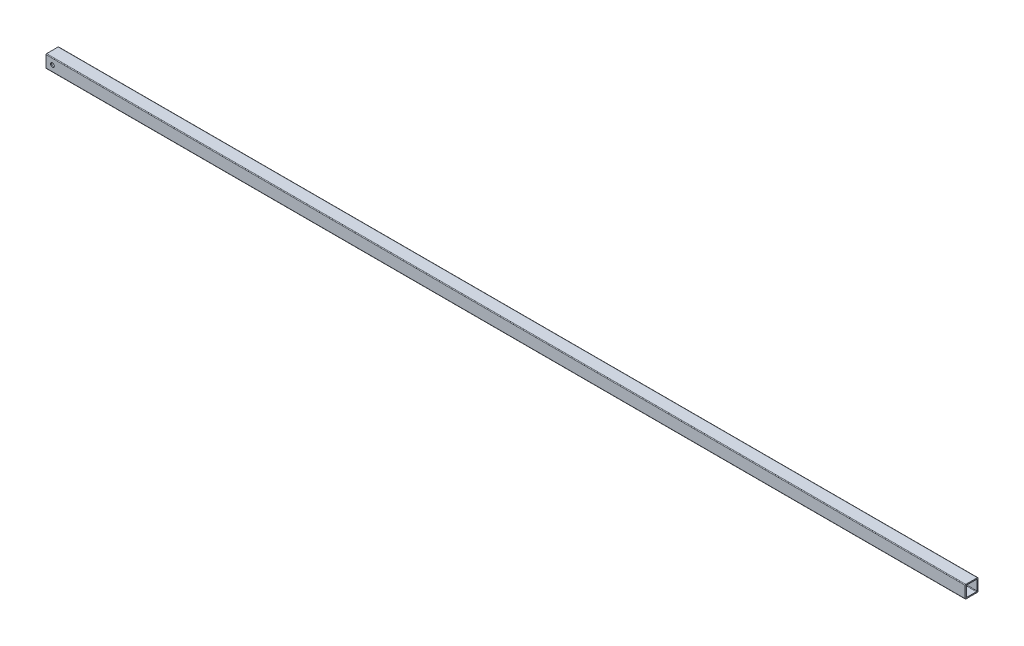
ISO-10303-21;
HEADER;
FILE_DESCRIPTION(('STEP AP214'),'2;1');
FILE_NAME('part.step','',(''),(''),'','','');
FILE_SCHEMA(('AUTOMOTIVE_DESIGN { 1 0 10303 214 1 1 1 1 }'));
ENDSEC;
DATA;
#1=APPLICATION_CONTEXT('core data for automotive mechanical design processes');
#2=APPLICATION_PROTOCOL_DEFINITION('international standard','automotive_design',2000,#1);
#3=PRODUCT_CONTEXT('',#1,'mechanical');
#4=PRODUCT('Part','Part','',(#3));
#5=PRODUCT_RELATED_PRODUCT_CATEGORY('part','',(#4));
#6=PRODUCT_DEFINITION_FORMATION('','',#4);
#7=PRODUCT_DEFINITION_CONTEXT('part definition',#1,'design');
#8=PRODUCT_DEFINITION('design','',#6,#7);
#9=PRODUCT_DEFINITION_SHAPE('','',#8);
#10=(LENGTH_UNIT() NAMED_UNIT(*) SI_UNIT(.MILLI.,.METRE.));
#11=(NAMED_UNIT(*) PLANE_ANGLE_UNIT() SI_UNIT($,.RADIAN.));
#12=(NAMED_UNIT(*) SI_UNIT($,.STERADIAN.) SOLID_ANGLE_UNIT());
#13=UNCERTAINTY_MEASURE_WITH_UNIT(LENGTH_MEASURE(1.E-05),#10,'distance_accuracy_value','');
#14=(GEOMETRIC_REPRESENTATION_CONTEXT(3) GLOBAL_UNCERTAINTY_ASSIGNED_CONTEXT((#13)) GLOBAL_UNIT_ASSIGNED_CONTEXT((#10,
#11,#12)) REPRESENTATION_CONTEXT('',''));
#15=CARTESIAN_POINT('',(0.,0.,0.));
#16=DIRECTION('',(0.,0.,1.));
#17=DIRECTION('',(1.,0.,0.));
#18=AXIS2_PLACEMENT_3D('',#15,#16,#17);
#19=CARTESIAN_POINT('',(914.4,-11.43,-11.43));
#20=DIRECTION('',(1.,0.,0.));
#21=DIRECTION('',(0.,0.,-1.));
#22=AXIS2_PLACEMENT_3D('',#19,#20,#21);
#23=PLANE('',#22);
#24=CARTESIAN_POINT('',(914.4,-11.43,-11.43));
#25=DIRECTION('',(1.,0.,0.));
#26=DIRECTION('',(0.,0.,-1.));
#27=AXIS2_PLACEMENT_3D('',#24,#25,#26);
#28=CIRCLE('',#27,1.27);
#29=CARTESIAN_POINT('',(914.4,-12.7,-11.43));
#30=VERTEX_POINT('',#29);
#31=CARTESIAN_POINT('',(914.4,-11.43,-12.7));
#32=VERTEX_POINT('',#31);
#33=EDGE_CURVE('E167',#30,#32,#28,.T.);
#34=ORIENTED_EDGE('',*,*,#33,.T.);
#35=DIRECTION('',(0.,1.,0.));
#36=VECTOR('',#35,1.);
#37=CARTESIAN_POINT('',(914.4,-11.43,-12.7));
#38=LINE('',#37,#36);
#39=CARTESIAN_POINT('',(914.4,11.43,-12.7));
#40=VERTEX_POINT('',#39);
#41=EDGE_CURVE('E254',#32,#40,#38,.T.);
#42=ORIENTED_EDGE('',*,*,#41,.T.);
#43=CARTESIAN_POINT('',(914.4,11.43,-11.43));
#44=DIRECTION('',(1.,0.,0.));
#45=DIRECTION('',(0.,0.,-1.));
#46=AXIS2_PLACEMENT_3D('',#43,#44,#45);
#47=CIRCLE('',#46,1.27);
#48=CARTESIAN_POINT('',(914.4,12.7,-11.43));
#49=VERTEX_POINT('',#48);
#50=EDGE_CURVE('E256',#40,#49,#47,.T.);
#51=ORIENTED_EDGE('',*,*,#50,.T.);
#52=DIRECTION('',(0.,0.,1.));
#53=VECTOR('',#52,1.);
#54=CARTESIAN_POINT('',(914.4,12.7,-11.43));
#55=LINE('',#54,#53);
#56=CARTESIAN_POINT('',(914.4,12.7,11.43));
#57=VERTEX_POINT('',#56);
#58=EDGE_CURVE('E258',#49,#57,#55,.T.);
#59=ORIENTED_EDGE('',*,*,#58,.T.);
#60=CARTESIAN_POINT('',(914.4,11.43,11.43));
#61=DIRECTION('',(1.,0.,0.));
#62=DIRECTION('',(0.,0.,-1.));
#63=AXIS2_PLACEMENT_3D('',#60,#61,#62);
#64=CIRCLE('',#63,1.27);
#65=CARTESIAN_POINT('',(914.4,11.43,12.7));
#66=VERTEX_POINT('',#65);
#67=EDGE_CURVE('E260',#57,#66,#64,.T.);
#68=ORIENTED_EDGE('',*,*,#67,.T.);
#69=DIRECTION('',(0.,-1.,0.));
#70=VECTOR('',#69,1.);
#71=CARTESIAN_POINT('',(914.4,-11.43,12.7));
#72=LINE('',#71,#70);
#73=CARTESIAN_POINT('',(914.4,-11.43,12.7));
#74=VERTEX_POINT('',#73);
#75=EDGE_CURVE('E262',#66,#74,#72,.T.);
#76=ORIENTED_EDGE('',*,*,#75,.T.);
#77=CARTESIAN_POINT('',(914.4,-11.43,11.43));
#78=DIRECTION('',(1.,0.,0.));
#79=DIRECTION('',(0.,0.,-1.));
#80=AXIS2_PLACEMENT_3D('',#77,#78,#79);
#81=CIRCLE('',#80,1.27);
#82=CARTESIAN_POINT('',(914.4,-12.7,11.43));
#83=VERTEX_POINT('',#82);
#84=EDGE_CURVE('E264',#74,#83,#81,.T.);
#85=ORIENTED_EDGE('',*,*,#84,.T.);
#86=DIRECTION('',(0.,0.,-1.));
#87=VECTOR('',#86,1.);
#88=CARTESIAN_POINT('',(914.4,-12.7,-11.43));
#89=LINE('',#88,#87);
#90=EDGE_CURVE('E66',#83,#30,#89,.T.);
#91=ORIENTED_EDGE('',*,*,#90,.T.);
#92=EDGE_LOOP('',(#34,#42,#51,#59,#68,#76,#85,#91));
#93=FACE_BOUND('',#92,.T.);
#94=DIRECTION('',(0.,0.,1.));
#95=VECTOR('',#94,1.);
#96=CARTESIAN_POINT('',(914.4,10.5918,-9.53261999999999));
#97=LINE('',#96,#95);
#98=CARTESIAN_POINT('',(914.4,10.5918,-9.53261999999999));
#99=VERTEX_POINT('',#98);
#100=CARTESIAN_POINT('',(914.4,10.5918,9.53261999999999));
#101=VERTEX_POINT('',#100);
#102=EDGE_CURVE('E227',#99,#101,#97,.T.);
#103=ORIENTED_EDGE('',*,*,#102,.F.);
#104=CARTESIAN_POINT('',(914.4,9.53261999999999,-9.53262));
#105=DIRECTION('',(1.,0.,0.));
#106=DIRECTION('',(0.,0.,-1.));
#107=AXIS2_PLACEMENT_3D('',#104,#105,#106);
#108=CIRCLE('',#107,1.05918);
#109=CARTESIAN_POINT('',(914.4,9.53261999999999,-10.5918));
#110=VERTEX_POINT('',#109);
#111=EDGE_CURVE('E164',#110,#99,#108,.T.);
#112=ORIENTED_EDGE('',*,*,#111,.F.);
#113=DIRECTION('',(0.,1.,0.));
#114=VECTOR('',#113,1.);
#115=CARTESIAN_POINT('',(914.4,9.53261999999999,-10.5918));
#116=LINE('',#115,#114);
#117=CARTESIAN_POINT('',(914.4,-9.53261999999999,-10.5918));
#118=VERTEX_POINT('',#117);
#119=EDGE_CURVE('E239',#118,#110,#116,.T.);
#120=ORIENTED_EDGE('',*,*,#119,.F.);
#121=CARTESIAN_POINT('',(914.4,-9.53261999999999,-9.53261999999999));
#122=DIRECTION('',(1.,0.,0.));
#123=DIRECTION('',(0.,0.,-1.));
#124=AXIS2_PLACEMENT_3D('',#121,#122,#123);
#125=CIRCLE('',#124,1.05918000000001);
#126=CARTESIAN_POINT('',(914.4,-10.5918,-9.53261999999999));
#127=VERTEX_POINT('',#126);
#128=EDGE_CURVE('E237',#127,#118,#125,.T.);
#129=ORIENTED_EDGE('',*,*,#128,.F.);
#130=DIRECTION('',(0.,0.,-1.));
#131=VECTOR('',#130,1.);
#132=CARTESIAN_POINT('',(914.4,-10.5918,-9.53261999999999));
#133=LINE('',#132,#131);
#134=CARTESIAN_POINT('',(914.4,-10.5918,9.53261999999999));
#135=VERTEX_POINT('',#134);
#136=EDGE_CURVE('E235',#135,#127,#133,.T.);
#137=ORIENTED_EDGE('',*,*,#136,.F.);
#138=CARTESIAN_POINT('',(914.4,-9.53261999999999,9.53261999999999));
#139=DIRECTION('',(1.,0.,0.));
#140=DIRECTION('',(0.,0.,-1.));
#141=AXIS2_PLACEMENT_3D('',#138,#139,#140);
#142=CIRCLE('',#141,1.05918);
#143=CARTESIAN_POINT('',(914.4,-9.53261999999999,10.5918));
#144=VERTEX_POINT('',#143);
#145=EDGE_CURVE('E233',#144,#135,#142,.T.);
#146=ORIENTED_EDGE('',*,*,#145,.F.);
#147=DIRECTION('',(0.,-1.,0.));
#148=VECTOR('',#147,1.);
#149=CARTESIAN_POINT('',(914.4,9.53261999999999,10.5918));
#150=LINE('',#149,#148);
#151=CARTESIAN_POINT('',(914.4,9.53261999999999,10.5918));
#152=VERTEX_POINT('',#151);
#153=EDGE_CURVE('E231',#152,#144,#150,.T.);
#154=ORIENTED_EDGE('',*,*,#153,.F.);
#155=CARTESIAN_POINT('',(914.4,9.53261999999999,9.53261999999999));
#156=DIRECTION('',(1.,0.,0.));
#157=DIRECTION('',(0.,0.,-1.));
#158=AXIS2_PLACEMENT_3D('',#155,#156,#157);
#159=CIRCLE('',#158,1.05918000000001);
#160=EDGE_CURVE('E229',#101,#152,#159,.T.);
#161=ORIENTED_EDGE('',*,*,#160,.F.);
#162=EDGE_LOOP('',(#103,#112,#120,#129,#137,#146,#154,#161));
#163=FACE_BOUND('',#162,.T.);
#164=ADVANCED_FACE('F42',(#93,#163),#23,.T.);
#165=CARTESIAN_POINT('',(914.4,-11.43,-11.43));
#166=DIRECTION('',(-1.,0.,0.));
#167=DIRECTION('',(0.,0.,1.));
#168=AXIS2_PLACEMENT_3D('',#165,#166,#167);
#169=CYLINDRICAL_SURFACE('',#168,1.27);
#170=DIRECTION('',(-1.,0.,0.));
#171=VECTOR('',#170,1.);
#172=CARTESIAN_POINT('',(914.4,-12.7,-11.43));
#173=LINE('',#172,#171);
#174=CARTESIAN_POINT('',(-914.4,-12.7,-11.43));
#175=VERTEX_POINT('',#174);
#176=EDGE_CURVE('E267',#30,#175,#173,.T.);
#177=ORIENTED_EDGE('',*,*,#176,.T.);
#178=CARTESIAN_POINT('',(-914.4,-11.43,-11.43));
#179=DIRECTION('',(1.,0.,0.));
#180=DIRECTION('',(0.,0.,-1.));
#181=AXIS2_PLACEMENT_3D('',#178,#179,#180);
#182=CIRCLE('',#181,1.27);
#183=CARTESIAN_POINT('',(-914.4,-11.43,-12.7));
#184=VERTEX_POINT('',#183);
#185=EDGE_CURVE('E202',#175,#184,#182,.T.);
#186=ORIENTED_EDGE('',*,*,#185,.T.);
#187=DIRECTION('',(-1.,0.,0.));
#188=VECTOR('',#187,1.);
#189=CARTESIAN_POINT('',(914.4,-11.43,-12.7));
#190=LINE('',#189,#188);
#191=EDGE_CURVE('E11',#32,#184,#190,.T.);
#192=ORIENTED_EDGE('',*,*,#191,.F.);
#193=ORIENTED_EDGE('',*,*,#33,.F.);
#194=EDGE_LOOP('',(#177,#186,#192,#193));
#195=FACE_BOUND('',#194,.T.);
#196=ADVANCED_FACE('F44',(#195),#169,.T.);
#197=CARTESIAN_POINT('',(914.4,-11.43,-12.7));
#198=DIRECTION('',(0.,0.,1.));
#199=DIRECTION('',(1.,0.,0.));
#200=AXIS2_PLACEMENT_3D('',#197,#198,#199);
#201=PLANE('',#200);
#202=CARTESIAN_POINT('',(-901.7,0.,-12.7));
#203=DIRECTION('',(0.,0.,1.));
#204=DIRECTION('',(1.,0.,0.));
#205=AXIS2_PLACEMENT_3D('',#202,#203,#204);
#206=CIRCLE('',#205,3.80999999999999);
#207=CARTESIAN_POINT('',(-897.89,0.,-12.7));
#208=VERTEX_POINT('',#207);
#209=EDGE_CURVE('E388',#208,#208,#206,.T.);
#210=ORIENTED_EDGE('',*,*,#209,.T.);
#211=EDGE_LOOP('',(#210));
#212=FACE_BOUND('',#211,.T.);
#213=ORIENTED_EDGE('',*,*,#191,.T.);
#214=DIRECTION('',(0.,1.,0.));
#215=VECTOR('',#214,1.);
#216=CARTESIAN_POINT('',(-914.4,-11.43,-12.7));
#217=LINE('',#216,#215);
#218=CARTESIAN_POINT('',(-914.4,11.43,-12.7));
#219=VERTEX_POINT('',#218);
#220=EDGE_CURVE('E205',#184,#219,#217,.T.);
#221=ORIENTED_EDGE('',*,*,#220,.T.);
#222=DIRECTION('',(-1.,0.,0.));
#223=VECTOR('',#222,1.);
#224=CARTESIAN_POINT('',(914.4,11.43,-12.7));
#225=LINE('',#224,#223);
#226=EDGE_CURVE('E51',#40,#219,#225,.T.);
#227=ORIENTED_EDGE('',*,*,#226,.F.);
#228=ORIENTED_EDGE('',*,*,#41,.F.);
#229=EDGE_LOOP('',(#213,#221,#227,#228));
#230=FACE_BOUND('',#229,.T.);
#231=ADVANCED_FACE('F290',(#212,#230),#201,.F.);
#232=CARTESIAN_POINT('',(914.4,11.43,-11.43));
#233=DIRECTION('',(-1.,0.,0.));
#234=DIRECTION('',(0.,0.,1.));
#235=AXIS2_PLACEMENT_3D('',#232,#233,#234);
#236=CYLINDRICAL_SURFACE('',#235,1.27);
#237=ORIENTED_EDGE('',*,*,#226,.T.);
#238=CARTESIAN_POINT('',(-914.4,11.43,-11.43));
#239=DIRECTION('',(1.,0.,0.));
#240=DIRECTION('',(0.,0.,-1.));
#241=AXIS2_PLACEMENT_3D('',#238,#239,#240);
#242=CIRCLE('',#241,1.27);
#243=CARTESIAN_POINT('',(-914.4,12.7,-11.43));
#244=VERTEX_POINT('',#243);
#245=EDGE_CURVE('E208',#219,#244,#242,.T.);
#246=ORIENTED_EDGE('',*,*,#245,.T.);
#247=DIRECTION('',(-1.,0.,0.));
#248=VECTOR('',#247,1.);
#249=CARTESIAN_POINT('',(914.4,12.7,-11.43));
#250=LINE('',#249,#248);
#251=EDGE_CURVE('E277',#49,#244,#250,.T.);
#252=ORIENTED_EDGE('',*,*,#251,.F.);
#253=ORIENTED_EDGE('',*,*,#50,.F.);
#254=EDGE_LOOP('',(#237,#246,#252,#253));
#255=FACE_BOUND('',#254,.T.);
#256=ADVANCED_FACE('F283',(#255),#236,.T.);
#257=CARTESIAN_POINT('',(914.4,12.7,-11.43));
#258=DIRECTION('',(0.,-1.,0.));
#259=DIRECTION('',(0.,0.,-1.));
#260=AXIS2_PLACEMENT_3D('',#257,#258,#259);
#261=PLANE('',#260);
#262=ORIENTED_EDGE('',*,*,#251,.T.);
#263=DIRECTION('',(0.,0.,1.));
#264=VECTOR('',#263,1.);
#265=CARTESIAN_POINT('',(-914.4,12.7,-11.43));
#266=LINE('',#265,#264);
#267=CARTESIAN_POINT('',(-914.4,12.7,11.43));
#268=VERTEX_POINT('',#267);
#269=EDGE_CURVE('E211',#244,#268,#266,.T.);
#270=ORIENTED_EDGE('',*,*,#269,.T.);
#271=DIRECTION('',(-1.,0.,0.));
#272=VECTOR('',#271,1.);
#273=CARTESIAN_POINT('',(914.4,12.7,11.43));
#274=LINE('',#273,#272);
#275=EDGE_CURVE('E275',#57,#268,#274,.T.);
#276=ORIENTED_EDGE('',*,*,#275,.F.);
#277=ORIENTED_EDGE('',*,*,#58,.F.);
#278=EDGE_LOOP('',(#262,#270,#276,#277));
#279=FACE_BOUND('',#278,.T.);
#280=ADVANCED_FACE('F313',(#279),#261,.F.);
#281=CARTESIAN_POINT('',(914.4,11.43,11.43));
#282=DIRECTION('',(-1.,0.,0.));
#283=DIRECTION('',(0.,0.,1.));
#284=AXIS2_PLACEMENT_3D('',#281,#282,#283);
#285=CYLINDRICAL_SURFACE('',#284,1.27);
#286=ORIENTED_EDGE('',*,*,#275,.T.);
#287=CARTESIAN_POINT('',(-914.4,11.43,11.43));
#288=DIRECTION('',(1.,0.,0.));
#289=DIRECTION('',(0.,0.,-1.));
#290=AXIS2_PLACEMENT_3D('',#287,#288,#289);
#291=CIRCLE('',#290,1.27);
#292=CARTESIAN_POINT('',(-914.4,11.43,12.7));
#293=VERTEX_POINT('',#292);
#294=EDGE_CURVE('E214',#268,#293,#291,.T.);
#295=ORIENTED_EDGE('',*,*,#294,.T.);
#296=DIRECTION('',(-1.,0.,0.));
#297=VECTOR('',#296,1.);
#298=CARTESIAN_POINT('',(914.4,11.43,12.7));
#299=LINE('',#298,#297);
#300=EDGE_CURVE('E273',#66,#293,#299,.T.);
#301=ORIENTED_EDGE('',*,*,#300,.F.);
#302=ORIENTED_EDGE('',*,*,#67,.F.);
#303=EDGE_LOOP('',(#286,#295,#301,#302));
#304=FACE_BOUND('',#303,.T.);
#305=ADVANCED_FACE('F310',(#304),#285,.T.);
#306=CARTESIAN_POINT('',(914.4,-11.43,12.7));
#307=DIRECTION('',(0.,0.,-1.));
#308=DIRECTION('',(-1.,0.,0.));
#309=AXIS2_PLACEMENT_3D('',#306,#307,#308);
#310=PLANE('',#309);
#311=CARTESIAN_POINT('',(-901.7,0.,12.7));
#312=DIRECTION('',(0.,0.,1.));
#313=DIRECTION('',(1.,0.,0.));
#314=AXIS2_PLACEMENT_3D('',#311,#312,#313);
#315=CIRCLE('',#314,3.80999999999999);
#316=CARTESIAN_POINT('',(-897.89,0.,12.7));
#317=VERTEX_POINT('',#316);
#318=EDGE_CURVE('E390',#317,#317,#315,.T.);
#319=ORIENTED_EDGE('',*,*,#318,.F.);
#320=EDGE_LOOP('',(#319));
#321=FACE_BOUND('',#320,.T.);
#322=ORIENTED_EDGE('',*,*,#300,.T.);
#323=DIRECTION('',(0.,-1.,0.));
#324=VECTOR('',#323,1.);
#325=CARTESIAN_POINT('',(-914.4,-11.43,12.7));
#326=LINE('',#325,#324);
#327=CARTESIAN_POINT('',(-914.4,-11.43,12.7));
#328=VERTEX_POINT('',#327);
#329=EDGE_CURVE('E217',#293,#328,#326,.T.);
#330=ORIENTED_EDGE('',*,*,#329,.T.);
#331=DIRECTION('',(-1.,0.,0.));
#332=VECTOR('',#331,1.);
#333=CARTESIAN_POINT('',(914.4,-11.43,12.7));
#334=LINE('',#333,#332);
#335=EDGE_CURVE('E271',#74,#328,#334,.T.);
#336=ORIENTED_EDGE('',*,*,#335,.F.);
#337=ORIENTED_EDGE('',*,*,#75,.F.);
#338=EDGE_LOOP('',(#322,#330,#336,#337));
#339=FACE_BOUND('',#338,.T.);
#340=ADVANCED_FACE('F305',(#321,#339),#310,.F.);
#341=CARTESIAN_POINT('',(914.4,-11.43,11.43));
#342=DIRECTION('',(-1.,0.,0.));
#343=DIRECTION('',(0.,0.,1.));
#344=AXIS2_PLACEMENT_3D('',#341,#342,#343);
#345=CYLINDRICAL_SURFACE('',#344,1.27);
#346=ORIENTED_EDGE('',*,*,#335,.T.);
#347=CARTESIAN_POINT('',(-914.4,-11.43,11.43));
#348=DIRECTION('',(1.,0.,0.));
#349=DIRECTION('',(0.,0.,-1.));
#350=AXIS2_PLACEMENT_3D('',#347,#348,#349);
#351=CIRCLE('',#350,1.27);
#352=CARTESIAN_POINT('',(-914.4,-12.7,11.43));
#353=VERTEX_POINT('',#352);
#354=EDGE_CURVE('E220',#328,#353,#351,.T.);
#355=ORIENTED_EDGE('',*,*,#354,.T.);
#356=DIRECTION('',(-1.,0.,0.));
#357=VECTOR('',#356,1.);
#358=CARTESIAN_POINT('',(914.4,-12.7,11.43));
#359=LINE('',#358,#357);
#360=EDGE_CURVE('E269',#83,#353,#359,.T.);
#361=ORIENTED_EDGE('',*,*,#360,.F.);
#362=ORIENTED_EDGE('',*,*,#84,.F.);
#363=EDGE_LOOP('',(#346,#355,#361,#362));
#364=FACE_BOUND('',#363,.T.);
#365=ADVANCED_FACE('F301',(#364),#345,.T.);
#366=CARTESIAN_POINT('',(914.4,-12.7,-11.43));
#367=DIRECTION('',(0.,1.,0.));
#368=DIRECTION('',(0.,0.,1.));
#369=AXIS2_PLACEMENT_3D('',#366,#367,#368);
#370=PLANE('',#369);
#371=ORIENTED_EDGE('',*,*,#360,.T.);
#372=DIRECTION('',(0.,0.,-1.));
#373=VECTOR('',#372,1.);
#374=CARTESIAN_POINT('',(-914.4,-12.7,-11.43));
#375=LINE('',#374,#373);
#376=EDGE_CURVE('E223',#353,#175,#375,.T.);
#377=ORIENTED_EDGE('',*,*,#376,.T.);
#378=ORIENTED_EDGE('',*,*,#176,.F.);
#379=ORIENTED_EDGE('',*,*,#90,.F.);
#380=EDGE_LOOP('',(#371,#377,#378,#379));
#381=FACE_BOUND('',#380,.T.);
#382=ADVANCED_FACE('F297',(#381),#370,.F.);
#383=CARTESIAN_POINT('',(914.4,9.53261999999999,-9.53262));
#384=DIRECTION('',(-1.,0.,0.));
#385=DIRECTION('',(0.,0.,1.));
#386=AXIS2_PLACEMENT_3D('',#383,#384,#385);
#387=CYLINDRICAL_SURFACE('',#386,1.05918);
#388=DIRECTION('',(-1.,0.,0.));
#389=VECTOR('',#388,1.);
#390=CARTESIAN_POINT('',(914.4,10.5918,-9.53261999999999));
#391=LINE('',#390,#389);
#392=CARTESIAN_POINT('',(-914.4,10.5918,-9.53261999999999));
#393=VERTEX_POINT('',#392);
#394=EDGE_CURVE('E156',#99,#393,#391,.T.);
#395=ORIENTED_EDGE('',*,*,#394,.T.);
#396=CARTESIAN_POINT('',(-914.4,9.53261999999999,-9.53262));
#397=DIRECTION('',(1.,0.,0.));
#398=DIRECTION('',(0.,0.,-1.));
#399=AXIS2_PLACEMENT_3D('',#396,#397,#398);
#400=CIRCLE('',#399,1.05918);
#401=CARTESIAN_POINT('',(-914.4,9.53261999999999,-10.5918));
#402=VERTEX_POINT('',#401);
#403=EDGE_CURVE('E161',#402,#393,#400,.T.);
#404=ORIENTED_EDGE('',*,*,#403,.F.);
#405=DIRECTION('',(-1.,0.,0.));
#406=VECTOR('',#405,1.);
#407=CARTESIAN_POINT('',(914.4,9.53261999999999,-10.5918));
#408=LINE('',#407,#406);
#409=EDGE_CURVE('E241',#110,#402,#408,.T.);
#410=ORIENTED_EDGE('',*,*,#409,.F.);
#411=ORIENTED_EDGE('',*,*,#111,.T.);
#412=EDGE_LOOP('',(#395,#404,#410,#411));
#413=FACE_BOUND('',#412,.T.);
#414=ADVANCED_FACE('F158',(#413),#387,.F.);
#415=CARTESIAN_POINT('',(914.4,10.5918,-9.53261999999999));
#416=DIRECTION('',(0.,-1.,0.));
#417=DIRECTION('',(0.,0.,-1.));
#418=AXIS2_PLACEMENT_3D('',#415,#416,#417);
#419=PLANE('',#418);
#420=DIRECTION('',(-1.,0.,0.));
#421=VECTOR('',#420,1.);
#422=CARTESIAN_POINT('',(914.4,10.5918,9.53261999999999));
#423=LINE('',#422,#421);
#424=CARTESIAN_POINT('',(-914.4,10.5918,9.53261999999999));
#425=VERTEX_POINT('',#424);
#426=EDGE_CURVE('E168',#101,#425,#423,.T.);
#427=ORIENTED_EDGE('',*,*,#426,.T.);
#428=DIRECTION('',(0.,0.,1.));
#429=VECTOR('',#428,1.);
#430=CARTESIAN_POINT('',(-914.4,10.5918,-9.53261999999999));
#431=LINE('',#430,#429);
#432=EDGE_CURVE('E171',#393,#425,#431,.T.);
#433=ORIENTED_EDGE('',*,*,#432,.F.);
#434=ORIENTED_EDGE('',*,*,#394,.F.);
#435=ORIENTED_EDGE('',*,*,#102,.T.);
#436=EDGE_LOOP('',(#427,#433,#434,#435));
#437=FACE_BOUND('',#436,.T.);
#438=ADVANCED_FACE('F172',(#437),#419,.T.);
#439=CARTESIAN_POINT('',(914.4,9.53261999999999,9.53261999999999));
#440=DIRECTION('',(-1.,0.,0.));
#441=DIRECTION('',(0.,0.,1.));
#442=AXIS2_PLACEMENT_3D('',#439,#440,#441);
#443=CYLINDRICAL_SURFACE('',#442,1.05918000000001);
#444=DIRECTION('',(-1.,0.,0.));
#445=VECTOR('',#444,1.);
#446=CARTESIAN_POINT('',(914.4,9.53261999999999,10.5918));
#447=LINE('',#446,#445);
#448=CARTESIAN_POINT('',(-914.4,9.53261999999999,10.5918));
#449=VERTEX_POINT('',#448);
#450=EDGE_CURVE('E250',#152,#449,#447,.T.);
#451=ORIENTED_EDGE('',*,*,#450,.T.);
#452=CARTESIAN_POINT('',(-914.4,9.53261999999999,9.53261999999999));
#453=DIRECTION('',(1.,0.,0.));
#454=DIRECTION('',(0.,0.,-1.));
#455=AXIS2_PLACEMENT_3D('',#452,#453,#454);
#456=CIRCLE('',#455,1.05918000000001);
#457=EDGE_CURVE('E177',#425,#449,#456,.T.);
#458=ORIENTED_EDGE('',*,*,#457,.F.);
#459=ORIENTED_EDGE('',*,*,#426,.F.);
#460=ORIENTED_EDGE('',*,*,#160,.T.);
#461=EDGE_LOOP('',(#451,#458,#459,#460));
#462=FACE_BOUND('',#461,.T.);
#463=ADVANCED_FACE('F322',(#462),#443,.F.);
#464=CARTESIAN_POINT('',(914.4,9.53261999999999,10.5918));
#465=DIRECTION('',(0.,0.,-1.));
#466=DIRECTION('',(0.,1.,0.));
#467=AXIS2_PLACEMENT_3D('',#464,#465,#466);
#468=PLANE('',#467);
#469=CARTESIAN_POINT('',(-901.7,0.,10.5918));
#470=DIRECTION('',(0.,0.,-1.));
#471=DIRECTION('',(0.,1.,0.));
#472=AXIS2_PLACEMENT_3D('',#469,#470,#471);
#473=CIRCLE('',#472,3.80999999999999);
#474=CARTESIAN_POINT('',(-901.7,3.80999999999999,10.5918));
#475=VERTEX_POINT('',#474);
#476=EDGE_CURVE('E183',#475,#475,#473,.T.);
#477=ORIENTED_EDGE('',*,*,#476,.F.);
#478=EDGE_LOOP('',(#477));
#479=FACE_BOUND('',#478,.T.);
#480=DIRECTION('',(-1.,0.,0.));
#481=VECTOR('',#480,1.);
#482=CARTESIAN_POINT('',(914.4,-9.53261999999999,10.5918));
#483=LINE('',#482,#481);
#484=CARTESIAN_POINT('',(-914.4,-9.53261999999999,10.5918));
#485=VERTEX_POINT('',#484);
#486=EDGE_CURVE('E248',#144,#485,#483,.T.);
#487=ORIENTED_EDGE('',*,*,#486,.T.);
#488=DIRECTION('',(0.,-1.,0.));
#489=VECTOR('',#488,1.);
#490=CARTESIAN_POINT('',(-914.4,9.53261999999999,10.5918));
#491=LINE('',#490,#489);
#492=EDGE_CURVE('E190',#449,#485,#491,.T.);
#493=ORIENTED_EDGE('',*,*,#492,.F.);
#494=ORIENTED_EDGE('',*,*,#450,.F.);
#495=ORIENTED_EDGE('',*,*,#153,.T.);
#496=EDGE_LOOP('',(#487,#493,#494,#495));
#497=FACE_BOUND('',#496,.T.);
#498=ADVANCED_FACE('F327',(#479,#497),#468,.T.);
#499=CARTESIAN_POINT('',(914.4,-9.53261999999999,9.53261999999999));
#500=DIRECTION('',(-1.,0.,0.));
#501=DIRECTION('',(0.,0.,1.));
#502=AXIS2_PLACEMENT_3D('',#499,#500,#501);
#503=CYLINDRICAL_SURFACE('',#502,1.05918);
#504=DIRECTION('',(-1.,0.,0.));
#505=VECTOR('',#504,1.);
#506=CARTESIAN_POINT('',(914.4,-10.5918,9.53261999999999));
#507=LINE('',#506,#505);
#508=CARTESIAN_POINT('',(-914.4,-10.5918,9.53261999999999));
#509=VERTEX_POINT('',#508);
#510=EDGE_CURVE('E246',#135,#509,#507,.T.);
#511=ORIENTED_EDGE('',*,*,#510,.T.);
#512=CARTESIAN_POINT('',(-914.4,-9.53261999999999,9.53261999999999));
#513=DIRECTION('',(1.,0.,0.));
#514=DIRECTION('',(0.,0.,-1.));
#515=AXIS2_PLACEMENT_3D('',#512,#513,#514);
#516=CIRCLE('',#515,1.05918);
#517=EDGE_CURVE('E193',#485,#509,#516,.T.);
#518=ORIENTED_EDGE('',*,*,#517,.F.);
#519=ORIENTED_EDGE('',*,*,#486,.F.);
#520=ORIENTED_EDGE('',*,*,#145,.T.);
#521=EDGE_LOOP('',(#511,#518,#519,#520));
#522=FACE_BOUND('',#521,.T.);
#523=ADVANCED_FACE('F331',(#522),#503,.F.);
#524=CARTESIAN_POINT('',(914.4,-10.5918,-9.53261999999999));
#525=DIRECTION('',(0.,1.,0.));
#526=DIRECTION('',(0.,0.,1.));
#527=AXIS2_PLACEMENT_3D('',#524,#525,#526);
#528=PLANE('',#527);
#529=DIRECTION('',(-1.,0.,0.));
#530=VECTOR('',#529,1.);
#531=CARTESIAN_POINT('',(914.4,-10.5918,-9.53261999999999));
#532=LINE('',#531,#530);
#533=CARTESIAN_POINT('',(-914.4,-10.5918,-9.53261999999999));
#534=VERTEX_POINT('',#533);
#535=EDGE_CURVE('E244',#127,#534,#532,.T.);
#536=ORIENTED_EDGE('',*,*,#535,.T.);
#537=DIRECTION('',(0.,0.,-1.));
#538=VECTOR('',#537,1.);
#539=CARTESIAN_POINT('',(-914.4,-10.5918,-9.53261999999999));
#540=LINE('',#539,#538);
#541=EDGE_CURVE('E196',#509,#534,#540,.T.);
#542=ORIENTED_EDGE('',*,*,#541,.F.);
#543=ORIENTED_EDGE('',*,*,#510,.F.);
#544=ORIENTED_EDGE('',*,*,#136,.T.);
#545=EDGE_LOOP('',(#536,#542,#543,#544));
#546=FACE_BOUND('',#545,.T.);
#547=ADVANCED_FACE('F336',(#546),#528,.T.);
#548=CARTESIAN_POINT('',(914.4,-9.53261999999999,-9.53261999999999));
#549=DIRECTION('',(-1.,0.,0.));
#550=DIRECTION('',(0.,0.,1.));
#551=AXIS2_PLACEMENT_3D('',#548,#549,#550);
#552=CYLINDRICAL_SURFACE('',#551,1.05918000000001);
#553=DIRECTION('',(-1.,0.,0.));
#554=VECTOR('',#553,1.);
#555=CARTESIAN_POINT('',(914.4,-9.53261999999999,-10.5918));
#556=LINE('',#555,#554);
#557=CARTESIAN_POINT('',(-914.4,-9.53261999999999,-10.5918));
#558=VERTEX_POINT('',#557);
#559=EDGE_CURVE('E58',#118,#558,#556,.T.);
#560=ORIENTED_EDGE('',*,*,#559,.T.);
#561=CARTESIAN_POINT('',(-914.4,-9.53261999999999,-9.53261999999999));
#562=DIRECTION('',(1.,0.,0.));
#563=DIRECTION('',(0.,0.,-1.));
#564=AXIS2_PLACEMENT_3D('',#561,#562,#563);
#565=CIRCLE('',#564,1.05918000000001);
#566=EDGE_CURVE('E199',#534,#558,#565,.T.);
#567=ORIENTED_EDGE('',*,*,#566,.F.);
#568=ORIENTED_EDGE('',*,*,#535,.F.);
#569=ORIENTED_EDGE('',*,*,#128,.T.);
#570=EDGE_LOOP('',(#560,#567,#568,#569));
#571=FACE_BOUND('',#570,.T.);
#572=ADVANCED_FACE('F340',(#571),#552,.F.);
#573=CARTESIAN_POINT('',(914.4,9.53261999999999,-10.5918));
#574=DIRECTION('',(0.,0.,1.));
#575=DIRECTION('',(1.,0.,0.));
#576=AXIS2_PLACEMENT_3D('',#573,#574,#575);
#577=PLANE('',#576);
#578=CARTESIAN_POINT('',(-901.7,0.,-10.5918));
#579=DIRECTION('',(0.,0.,1.));
#580=DIRECTION('',(1.,0.,0.));
#581=AXIS2_PLACEMENT_3D('',#578,#579,#580);
#582=CIRCLE('',#581,3.80999999999999);
#583=CARTESIAN_POINT('',(-897.89,0.,-10.5918));
#584=VERTEX_POINT('',#583);
#585=EDGE_CURVE('E46',#584,#584,#582,.T.);
#586=ORIENTED_EDGE('',*,*,#585,.F.);
#587=EDGE_LOOP('',(#586));
#588=FACE_BOUND('',#587,.T.);
#589=ORIENTED_EDGE('',*,*,#409,.T.);
#590=DIRECTION('',(0.,1.,0.));
#591=VECTOR('',#590,1.);
#592=CARTESIAN_POINT('',(-914.4,9.53261999999999,-10.5918));
#593=LINE('',#592,#591);
#594=EDGE_CURVE('E182',#558,#402,#593,.T.);
#595=ORIENTED_EDGE('',*,*,#594,.F.);
#596=ORIENTED_EDGE('',*,*,#559,.F.);
#597=ORIENTED_EDGE('',*,*,#119,.T.);
#598=EDGE_LOOP('',(#589,#595,#596,#597));
#599=FACE_BOUND('',#598,.T.);
#600=ADVANCED_FACE('F342',(#588,#599),#577,.T.);
#601=CARTESIAN_POINT('',(-914.4,-11.43,-11.43));
#602=DIRECTION('',(1.,0.,0.));
#603=DIRECTION('',(0.,0.,-1.));
#604=AXIS2_PLACEMENT_3D('',#601,#602,#603);
#605=PLANE('',#604);
#606=ORIENTED_EDGE('',*,*,#594,.T.);
#607=ORIENTED_EDGE('',*,*,#403,.T.);
#608=ORIENTED_EDGE('',*,*,#432,.T.);
#609=ORIENTED_EDGE('',*,*,#457,.T.);
#610=ORIENTED_EDGE('',*,*,#492,.T.);
#611=ORIENTED_EDGE('',*,*,#517,.T.);
#612=ORIENTED_EDGE('',*,*,#541,.T.);
#613=ORIENTED_EDGE('',*,*,#566,.T.);
#614=EDGE_LOOP('',(#606,#607,#608,#609,#610,#611,#612,#613));
#615=FACE_BOUND('',#614,.T.);
#616=ORIENTED_EDGE('',*,*,#185,.F.);
#617=ORIENTED_EDGE('',*,*,#376,.F.);
#618=ORIENTED_EDGE('',*,*,#354,.F.);
#619=ORIENTED_EDGE('',*,*,#329,.F.);
#620=ORIENTED_EDGE('',*,*,#294,.F.);
#621=ORIENTED_EDGE('',*,*,#269,.F.);
#622=ORIENTED_EDGE('',*,*,#245,.F.);
#623=ORIENTED_EDGE('',*,*,#220,.F.);
#624=EDGE_LOOP('',(#616,#617,#618,#619,#620,#621,#622,#623));
#625=FACE_BOUND('',#624,.T.);
#626=ADVANCED_FACE('F179',(#615,#625),#605,.F.);
#627=CARTESIAN_POINT('',(-901.7,0.,-12.7));
#628=DIRECTION('',(0.,0.,1.));
#629=DIRECTION('',(1.,0.,0.));
#630=AXIS2_PLACEMENT_3D('',#627,#628,#629);
#631=CYLINDRICAL_SURFACE('',#630,3.80999999999999);
#632=ORIENTED_EDGE('',*,*,#585,.T.);
#633=EDGE_LOOP('',(#632));
#634=FACE_BOUND('',#633,.T.);
#635=ORIENTED_EDGE('',*,*,#209,.F.);
#636=EDGE_LOOP('',(#635));
#637=FACE_BOUND('',#636,.T.);
#638=ADVANCED_FACE('F350',(#634,#637),#631,.F.);
#639=ORIENTED_EDGE('',*,*,#476,.T.);
#640=EDGE_LOOP('',(#639));
#641=FACE_BOUND('',#640,.T.);
#642=ORIENTED_EDGE('',*,*,#318,.T.);
#643=EDGE_LOOP('',(#642));
#644=FACE_BOUND('',#643,.T.);
#645=ADVANCED_FACE('F396',(#641,#644),#631,.F.);
#646=CLOSED_SHELL('',(#164,#196,#231,#256,#280,#305,#340,#365,#382,#414,#438,#463,#498,#523,
#547,#572,#600,#626,#638,#645));
#647=MANIFOLD_SOLID_BREP('B2',#646);
#648=ADVANCED_BREP_SHAPE_REPRESENTATION('',(#18,#647),#14);
#649=SHAPE_DEFINITION_REPRESENTATION(#9,#648);
ENDSEC;
END-ISO-10303-21;
